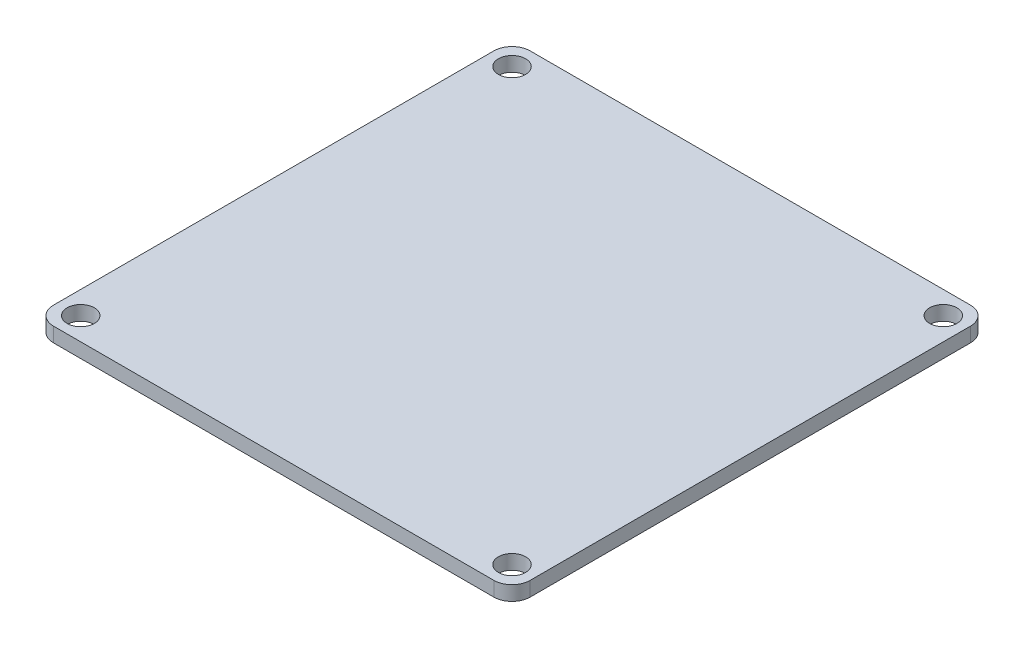
ISO-10303-21;
HEADER;
FILE_DESCRIPTION(('STEP AP214'),'2;1');
FILE_NAME('part.step','',(''),(''),'','','');
FILE_SCHEMA(('AUTOMOTIVE_DESIGN { 1 0 10303 214 1 1 1 1 }'));
ENDSEC;
DATA;
#1=APPLICATION_CONTEXT('core data for automotive mechanical design processes');
#2=APPLICATION_PROTOCOL_DEFINITION('international standard','automotive_design',2000,#1);
#3=PRODUCT_CONTEXT('',#1,'mechanical');
#4=PRODUCT('Part','Part','',(#3));
#5=PRODUCT_RELATED_PRODUCT_CATEGORY('part','',(#4));
#6=PRODUCT_DEFINITION_FORMATION('','',#4);
#7=PRODUCT_DEFINITION_CONTEXT('part definition',#1,'design');
#8=PRODUCT_DEFINITION('design','',#6,#7);
#9=PRODUCT_DEFINITION_SHAPE('','',#8);
#10=(LENGTH_UNIT() NAMED_UNIT(*) SI_UNIT(.MILLI.,.METRE.));
#11=(NAMED_UNIT(*) PLANE_ANGLE_UNIT() SI_UNIT($,.RADIAN.));
#12=(NAMED_UNIT(*) SI_UNIT($,.STERADIAN.) SOLID_ANGLE_UNIT());
#13=UNCERTAINTY_MEASURE_WITH_UNIT(LENGTH_MEASURE(1.E-05),#10,'distance_accuracy_value','');
#14=(GEOMETRIC_REPRESENTATION_CONTEXT(3) GLOBAL_UNCERTAINTY_ASSIGNED_CONTEXT((#13)) GLOBAL_UNIT_ASSIGNED_CONTEXT((#10,
#11,#12)) REPRESENTATION_CONTEXT('',''));
#15=CARTESIAN_POINT('',(0.,0.,0.));
#16=DIRECTION('',(0.,0.,1.));
#17=DIRECTION('',(1.,0.,0.));
#18=AXIS2_PLACEMENT_3D('',#15,#16,#17);
#19=CARTESIAN_POINT('',(0.,1.6,0.));
#20=DIRECTION('',(0.,-1.,0.));
#21=DIRECTION('',(0.,0.,-1.));
#22=AXIS2_PLACEMENT_3D('',#19,#20,#21);
#23=PLANE('',#22);
#24=DIRECTION('',(-1.,0.,0.));
#25=VECTOR('',#24,1.);
#26=CARTESIAN_POINT('',(-26.25,1.6,-26.25));
#27=LINE('',#26,#25);
#28=CARTESIAN_POINT('',(24.25,1.6,-26.25));
#29=VERTEX_POINT('',#28);
#30=CARTESIAN_POINT('',(-24.25,1.6,-26.25));
#31=VERTEX_POINT('',#30);
#32=EDGE_CURVE('E138',#29,#31,#27,.T.);
#33=ORIENTED_EDGE('',*,*,#32,.T.);
#34=CARTESIAN_POINT('',(-24.25,1.6,-24.25));
#35=DIRECTION('',(0.,-1.,0.));
#36=DIRECTION('',(0.,0.,-1.));
#37=AXIS2_PLACEMENT_3D('',#34,#35,#36);
#38=CIRCLE('',#37,2.);
#39=CARTESIAN_POINT('',(-26.25,1.6,-24.25));
#40=VERTEX_POINT('',#39);
#41=EDGE_CURVE('E153',#31,#40,#38,.F.);
#42=ORIENTED_EDGE('',*,*,#41,.T.);
#43=DIRECTION('',(0.,0.,1.));
#44=VECTOR('',#43,1.);
#45=CARTESIAN_POINT('',(-26.25,1.6,-26.25));
#46=LINE('',#45,#44);
#47=CARTESIAN_POINT('',(-26.25,1.6,24.25));
#48=VERTEX_POINT('',#47);
#49=EDGE_CURVE('E120',#40,#48,#46,.T.);
#50=ORIENTED_EDGE('',*,*,#49,.T.);
#51=CARTESIAN_POINT('',(-24.25,1.6,24.25));
#52=DIRECTION('',(0.,-1.,0.));
#53=DIRECTION('',(0.,0.,-1.));
#54=AXIS2_PLACEMENT_3D('',#51,#52,#53);
#55=CIRCLE('',#54,2.);
#56=CARTESIAN_POINT('',(-24.25,1.6,26.25));
#57=VERTEX_POINT('',#56);
#58=EDGE_CURVE('E151',#48,#57,#55,.F.);
#59=ORIENTED_EDGE('',*,*,#58,.T.);
#60=DIRECTION('',(1.,0.,0.));
#61=VECTOR('',#60,1.);
#62=CARTESIAN_POINT('',(-26.25,1.6,26.25));
#63=LINE('',#62,#61);
#64=CARTESIAN_POINT('',(24.25,1.6,26.25));
#65=VERTEX_POINT('',#64);
#66=EDGE_CURVE('E173',#57,#65,#63,.T.);
#67=ORIENTED_EDGE('',*,*,#66,.T.);
#68=CARTESIAN_POINT('',(24.25,1.6,24.25));
#69=DIRECTION('',(0.,-1.,0.));
#70=DIRECTION('',(0.,0.,-1.));
#71=AXIS2_PLACEMENT_3D('',#68,#69,#70);
#72=CIRCLE('',#71,2.);
#73=CARTESIAN_POINT('',(26.25,1.6,24.25));
#74=VERTEX_POINT('',#73);
#75=EDGE_CURVE('E55',#65,#74,#72,.F.);
#76=ORIENTED_EDGE('',*,*,#75,.T.);
#77=DIRECTION('',(0.,0.,-1.));
#78=VECTOR('',#77,1.);
#79=CARTESIAN_POINT('',(26.25,1.6,-26.25));
#80=LINE('',#79,#78);
#81=CARTESIAN_POINT('',(26.25,1.6,-24.25));
#82=VERTEX_POINT('',#81);
#83=EDGE_CURVE('E139',#74,#82,#80,.T.);
#84=ORIENTED_EDGE('',*,*,#83,.T.);
#85=CARTESIAN_POINT('',(24.25,1.6,-24.25));
#86=DIRECTION('',(0.,-1.,0.));
#87=DIRECTION('',(0.,0.,-1.));
#88=AXIS2_PLACEMENT_3D('',#85,#86,#87);
#89=CIRCLE('',#88,2.);
#90=EDGE_CURVE('E149',#82,#29,#89,.F.);
#91=ORIENTED_EDGE('',*,*,#90,.T.);
#92=EDGE_LOOP('',(#33,#42,#50,#59,#67,#76,#84,#91));
#93=FACE_BOUND('',#92,.T.);
#94=CARTESIAN_POINT('',(-23.75,1.6,-23.75));
#95=DIRECTION('',(0.,1.,0.));
#96=DIRECTION('',(0.,0.,1.));
#97=AXIS2_PLACEMENT_3D('',#94,#95,#96);
#98=CIRCLE('',#97,1.5);
#99=CARTESIAN_POINT('',(-23.75,1.6,-22.25));
#100=VERTEX_POINT('',#99);
#101=EDGE_CURVE('E133',#100,#100,#98,.T.);
#102=ORIENTED_EDGE('',*,*,#101,.F.);
#103=EDGE_LOOP('',(#102));
#104=FACE_BOUND('',#103,.T.);
#105=CARTESIAN_POINT('',(23.75,1.6,-23.75));
#106=DIRECTION('',(0.,1.,0.));
#107=DIRECTION('',(0.,0.,-1.));
#108=AXIS2_PLACEMENT_3D('',#105,#106,#107);
#109=CIRCLE('',#108,1.5);
#110=CARTESIAN_POINT('',(23.75,1.6,-25.25));
#111=VERTEX_POINT('',#110);
#112=EDGE_CURVE('E188',#111,#111,#109,.T.);
#113=ORIENTED_EDGE('',*,*,#112,.F.);
#114=EDGE_LOOP('',(#113));
#115=FACE_BOUND('',#114,.T.);
#116=CARTESIAN_POINT('',(23.75,1.6,23.75));
#117=DIRECTION('',(0.,1.,0.));
#118=DIRECTION('',(0.,0.,1.));
#119=AXIS2_PLACEMENT_3D('',#116,#117,#118);
#120=CIRCLE('',#119,1.5);
#121=CARTESIAN_POINT('',(23.75,1.6,25.25));
#122=VERTEX_POINT('',#121);
#123=EDGE_CURVE('E192',#122,#122,#120,.T.);
#124=ORIENTED_EDGE('',*,*,#123,.F.);
#125=EDGE_LOOP('',(#124));
#126=FACE_BOUND('',#125,.T.);
#127=CARTESIAN_POINT('',(-23.75,1.6,23.75));
#128=DIRECTION('',(0.,1.,0.));
#129=DIRECTION('',(0.,0.,-1.));
#130=AXIS2_PLACEMENT_3D('',#127,#128,#129);
#131=CIRCLE('',#130,1.5);
#132=CARTESIAN_POINT('',(-23.75,1.6,22.25));
#133=VERTEX_POINT('',#132);
#134=EDGE_CURVE('E195',#133,#133,#131,.T.);
#135=ORIENTED_EDGE('',*,*,#134,.F.);
#136=EDGE_LOOP('',(#135));
#137=FACE_BOUND('',#136,.T.);
#138=ADVANCED_FACE('F35',(#93,#104,#115,#126,#137),#23,.F.);
#139=CARTESIAN_POINT('',(0.,0.,0.));
#140=DIRECTION('',(0.,-1.,0.));
#141=DIRECTION('',(0.,0.,-1.));
#142=AXIS2_PLACEMENT_3D('',#139,#140,#141);
#143=PLANE('',#142);
#144=CARTESIAN_POINT('',(23.75,0.,23.75));
#145=DIRECTION('',(0.,1.,0.));
#146=DIRECTION('',(0.,0.,1.));
#147=AXIS2_PLACEMENT_3D('',#144,#145,#146);
#148=CIRCLE('',#147,1.5);
#149=CARTESIAN_POINT('',(23.75,0.,25.25));
#150=VERTEX_POINT('',#149);
#151=EDGE_CURVE('E197',#150,#150,#148,.T.);
#152=ORIENTED_EDGE('',*,*,#151,.T.);
#153=EDGE_LOOP('',(#152));
#154=FACE_BOUND('',#153,.T.);
#155=CARTESIAN_POINT('',(-23.75,0.,-23.75));
#156=DIRECTION('',(0.,1.,0.));
#157=DIRECTION('',(0.,0.,1.));
#158=AXIS2_PLACEMENT_3D('',#155,#156,#157);
#159=CIRCLE('',#158,1.5);
#160=CARTESIAN_POINT('',(-23.75,0.,-22.25));
#161=VERTEX_POINT('',#160);
#162=EDGE_CURVE('E176',#161,#161,#159,.T.);
#163=ORIENTED_EDGE('',*,*,#162,.T.);
#164=EDGE_LOOP('',(#163));
#165=FACE_BOUND('',#164,.T.);
#166=DIRECTION('',(0.,0.,1.));
#167=VECTOR('',#166,1.);
#168=CARTESIAN_POINT('',(-26.25,0.,-26.25));
#169=LINE('',#168,#167);
#170=CARTESIAN_POINT('',(-26.25,0.,-24.25));
#171=VERTEX_POINT('',#170);
#172=CARTESIAN_POINT('',(-26.25,0.,24.25));
#173=VERTEX_POINT('',#172);
#174=EDGE_CURVE('E117',#171,#173,#169,.T.);
#175=ORIENTED_EDGE('',*,*,#174,.F.);
#176=CARTESIAN_POINT('',(-24.25,0.,-24.25));
#177=DIRECTION('',(0.,-1.,0.));
#178=DIRECTION('',(0.,0.,-1.));
#179=AXIS2_PLACEMENT_3D('',#176,#177,#178);
#180=CIRCLE('',#179,2.);
#181=CARTESIAN_POINT('',(-24.25,0.,-26.25));
#182=VERTEX_POINT('',#181);
#183=EDGE_CURVE('E100',#171,#182,#180,.T.);
#184=ORIENTED_EDGE('',*,*,#183,.T.);
#185=DIRECTION('',(-1.,0.,0.));
#186=VECTOR('',#185,1.);
#187=CARTESIAN_POINT('',(-26.25,0.,-26.25));
#188=LINE('',#187,#186);
#189=CARTESIAN_POINT('',(24.25,0.,-26.25));
#190=VERTEX_POINT('',#189);
#191=EDGE_CURVE('E128',#190,#182,#188,.T.);
#192=ORIENTED_EDGE('',*,*,#191,.F.);
#193=CARTESIAN_POINT('',(24.25,0.,-24.25));
#194=DIRECTION('',(0.,-1.,0.));
#195=DIRECTION('',(0.,0.,-1.));
#196=AXIS2_PLACEMENT_3D('',#193,#194,#195);
#197=CIRCLE('',#196,2.);
#198=CARTESIAN_POINT('',(26.25,0.,-24.25));
#199=VERTEX_POINT('',#198);
#200=EDGE_CURVE('E142',#190,#199,#197,.T.);
#201=ORIENTED_EDGE('',*,*,#200,.T.);
#202=DIRECTION('',(0.,0.,-1.));
#203=VECTOR('',#202,1.);
#204=CARTESIAN_POINT('',(26.25,0.,-26.25));
#205=LINE('',#204,#203);
#206=CARTESIAN_POINT('',(26.25,0.,24.25));
#207=VERTEX_POINT('',#206);
#208=EDGE_CURVE('E131',#207,#199,#205,.T.);
#209=ORIENTED_EDGE('',*,*,#208,.F.);
#210=CARTESIAN_POINT('',(24.25,0.,24.25));
#211=DIRECTION('',(0.,-1.,0.));
#212=DIRECTION('',(0.,0.,-1.));
#213=AXIS2_PLACEMENT_3D('',#210,#211,#212);
#214=CIRCLE('',#213,2.);
#215=CARTESIAN_POINT('',(24.25,0.,26.25));
#216=VERTEX_POINT('',#215);
#217=EDGE_CURVE('E121',#207,#216,#214,.T.);
#218=ORIENTED_EDGE('',*,*,#217,.T.);
#219=DIRECTION('',(1.,0.,0.));
#220=VECTOR('',#219,1.);
#221=CARTESIAN_POINT('',(-26.25,0.,26.25));
#222=LINE('',#221,#220);
#223=CARTESIAN_POINT('',(-24.25,0.,26.25));
#224=VERTEX_POINT('',#223);
#225=EDGE_CURVE('E127',#224,#216,#222,.T.);
#226=ORIENTED_EDGE('',*,*,#225,.F.);
#227=CARTESIAN_POINT('',(-24.25,0.,24.25));
#228=DIRECTION('',(0.,-1.,0.));
#229=DIRECTION('',(0.,0.,-1.));
#230=AXIS2_PLACEMENT_3D('',#227,#228,#229);
#231=CIRCLE('',#230,2.);
#232=EDGE_CURVE('E111',#224,#173,#231,.T.);
#233=ORIENTED_EDGE('',*,*,#232,.T.);
#234=EDGE_LOOP('',(#175,#184,#192,#201,#209,#218,#226,#233));
#235=FACE_BOUND('',#234,.T.);
#236=CARTESIAN_POINT('',(23.75,0.,-23.75));
#237=DIRECTION('',(0.,1.,0.));
#238=DIRECTION('',(0.,0.,-1.));
#239=AXIS2_PLACEMENT_3D('',#236,#237,#238);
#240=CIRCLE('',#239,1.5);
#241=CARTESIAN_POINT('',(23.75,0.,-25.25));
#242=VERTEX_POINT('',#241);
#243=EDGE_CURVE('E205',#242,#242,#240,.T.);
#244=ORIENTED_EDGE('',*,*,#243,.T.);
#245=EDGE_LOOP('',(#244));
#246=FACE_BOUND('',#245,.T.);
#247=CARTESIAN_POINT('',(-23.75,0.,23.75));
#248=DIRECTION('',(0.,1.,0.));
#249=DIRECTION('',(0.,0.,-1.));
#250=AXIS2_PLACEMENT_3D('',#247,#248,#249);
#251=CIRCLE('',#250,1.5);
#252=CARTESIAN_POINT('',(-23.75,0.,22.25));
#253=VERTEX_POINT('',#252);
#254=EDGE_CURVE('E198',#253,#253,#251,.T.);
#255=ORIENTED_EDGE('',*,*,#254,.T.);
#256=EDGE_LOOP('',(#255));
#257=FACE_BOUND('',#256,.T.);
#258=ADVANCED_FACE('F124',(#154,#165,#235,#246,#257),#143,.T.);
#259=CARTESIAN_POINT('',(-26.25,1.6,-26.25));
#260=DIRECTION('',(0.,0.,1.));
#261=DIRECTION('',(1.,0.,0.));
#262=AXIS2_PLACEMENT_3D('',#259,#260,#261);
#263=PLANE('',#262);
#264=ORIENTED_EDGE('',*,*,#191,.T.);
#265=DIRECTION('',(0.,-1.,0.));
#266=VECTOR('',#265,1.);
#267=CARTESIAN_POINT('',(-24.25,1.6,-26.25));
#268=LINE('',#267,#266);
#269=EDGE_CURVE('E105',#182,#31,#268,.F.);
#270=ORIENTED_EDGE('',*,*,#269,.T.);
#271=ORIENTED_EDGE('',*,*,#32,.F.);
#272=DIRECTION('',(0.,-1.,0.));
#273=VECTOR('',#272,1.);
#274=CARTESIAN_POINT('',(24.25,1.6,-26.25));
#275=LINE('',#274,#273);
#276=EDGE_CURVE('E110',#29,#190,#275,.T.);
#277=ORIENTED_EDGE('',*,*,#276,.T.);
#278=EDGE_LOOP('',(#264,#270,#271,#277));
#279=FACE_BOUND('',#278,.T.);
#280=ADVANCED_FACE('F170',(#279),#263,.F.);
#281=CARTESIAN_POINT('',(-26.25,1.6,-26.25));
#282=DIRECTION('',(1.,0.,0.));
#283=DIRECTION('',(0.,0.,-1.));
#284=AXIS2_PLACEMENT_3D('',#281,#282,#283);
#285=PLANE('',#284);
#286=ORIENTED_EDGE('',*,*,#49,.F.);
#287=DIRECTION('',(0.,-1.,0.));
#288=VECTOR('',#287,1.);
#289=CARTESIAN_POINT('',(-26.25,1.6,-24.25));
#290=LINE('',#289,#288);
#291=EDGE_CURVE('E104',#40,#171,#290,.T.);
#292=ORIENTED_EDGE('',*,*,#291,.T.);
#293=ORIENTED_EDGE('',*,*,#174,.T.);
#294=DIRECTION('',(0.,-1.,0.));
#295=VECTOR('',#294,1.);
#296=CARTESIAN_POINT('',(-26.25,1.6,24.25));
#297=LINE('',#296,#295);
#298=EDGE_CURVE('E122',#173,#48,#297,.F.);
#299=ORIENTED_EDGE('',*,*,#298,.T.);
#300=EDGE_LOOP('',(#286,#292,#293,#299));
#301=FACE_BOUND('',#300,.T.);
#302=ADVANCED_FACE('F116',(#301),#285,.F.);
#303=CARTESIAN_POINT('',(-26.25,1.6,26.25));
#304=DIRECTION('',(0.,0.,-1.));
#305=DIRECTION('',(-1.,0.,0.));
#306=AXIS2_PLACEMENT_3D('',#303,#304,#305);
#307=PLANE('',#306);
#308=ORIENTED_EDGE('',*,*,#66,.F.);
#309=DIRECTION('',(0.,-1.,0.));
#310=VECTOR('',#309,1.);
#311=CARTESIAN_POINT('',(-24.25,1.6,26.25));
#312=LINE('',#311,#310);
#313=EDGE_CURVE('E157',#57,#224,#312,.T.);
#314=ORIENTED_EDGE('',*,*,#313,.T.);
#315=ORIENTED_EDGE('',*,*,#225,.T.);
#316=DIRECTION('',(0.,-1.,0.));
#317=VECTOR('',#316,1.);
#318=CARTESIAN_POINT('',(24.25,1.6,26.25));
#319=LINE('',#318,#317);
#320=EDGE_CURVE('E155',#216,#65,#319,.F.);
#321=ORIENTED_EDGE('',*,*,#320,.T.);
#322=EDGE_LOOP('',(#308,#314,#315,#321));
#323=FACE_BOUND('',#322,.T.);
#324=ADVANCED_FACE('F225',(#323),#307,.F.);
#325=CARTESIAN_POINT('',(26.25,1.6,-26.25));
#326=DIRECTION('',(-1.,0.,0.));
#327=DIRECTION('',(0.,0.,1.));
#328=AXIS2_PLACEMENT_3D('',#325,#326,#327);
#329=PLANE('',#328);
#330=ORIENTED_EDGE('',*,*,#208,.T.);
#331=DIRECTION('',(0.,-1.,0.));
#332=VECTOR('',#331,1.);
#333=CARTESIAN_POINT('',(26.25,1.6,-24.25));
#334=LINE('',#333,#332);
#335=EDGE_CURVE('E11',#199,#82,#334,.F.);
#336=ORIENTED_EDGE('',*,*,#335,.T.);
#337=ORIENTED_EDGE('',*,*,#83,.F.);
#338=DIRECTION('',(0.,-1.,0.));
#339=VECTOR('',#338,1.);
#340=CARTESIAN_POINT('',(26.25,1.6,24.25));
#341=LINE('',#340,#339);
#342=EDGE_CURVE('E43',#74,#207,#341,.T.);
#343=ORIENTED_EDGE('',*,*,#342,.T.);
#344=EDGE_LOOP('',(#330,#336,#337,#343));
#345=FACE_BOUND('',#344,.T.);
#346=ADVANCED_FACE('F162',(#345),#329,.F.);
#347=CARTESIAN_POINT('',(-23.75,1.6,-23.75));
#348=DIRECTION('',(0.,-1.,0.));
#349=DIRECTION('',(0.,0.,-1.));
#350=AXIS2_PLACEMENT_3D('',#347,#348,#349);
#351=CYLINDRICAL_SURFACE('',#350,1.5);
#352=ORIENTED_EDGE('',*,*,#101,.T.);
#353=EDGE_LOOP('',(#352));
#354=FACE_BOUND('',#353,.T.);
#355=ORIENTED_EDGE('',*,*,#162,.F.);
#356=EDGE_LOOP('',(#355));
#357=FACE_BOUND('',#356,.T.);
#358=ADVANCED_FACE('F214',(#354,#357),#351,.F.);
#359=CARTESIAN_POINT('',(23.75,1.6,-23.75));
#360=DIRECTION('',(0.,-1.,0.));
#361=DIRECTION('',(0.,0.,-1.));
#362=AXIS2_PLACEMENT_3D('',#359,#360,#361);
#363=CYLINDRICAL_SURFACE('',#362,1.5);
#364=ORIENTED_EDGE('',*,*,#112,.T.);
#365=EDGE_LOOP('',(#364));
#366=FACE_BOUND('',#365,.T.);
#367=ORIENTED_EDGE('',*,*,#243,.F.);
#368=EDGE_LOOP('',(#367));
#369=FACE_BOUND('',#368,.T.);
#370=ADVANCED_FACE('F216',(#366,#369),#363,.F.);
#371=CARTESIAN_POINT('',(23.75,1.6,23.75));
#372=DIRECTION('',(0.,-1.,0.));
#373=DIRECTION('',(0.,0.,-1.));
#374=AXIS2_PLACEMENT_3D('',#371,#372,#373);
#375=CYLINDRICAL_SURFACE('',#374,1.5);
#376=ORIENTED_EDGE('',*,*,#123,.T.);
#377=EDGE_LOOP('',(#376));
#378=FACE_BOUND('',#377,.T.);
#379=ORIENTED_EDGE('',*,*,#151,.F.);
#380=EDGE_LOOP('',(#379));
#381=FACE_BOUND('',#380,.T.);
#382=ADVANCED_FACE('F222',(#378,#381),#375,.F.);
#383=CARTESIAN_POINT('',(-23.75,1.6,23.75));
#384=DIRECTION('',(0.,-1.,0.));
#385=DIRECTION('',(0.,0.,-1.));
#386=AXIS2_PLACEMENT_3D('',#383,#384,#385);
#387=CYLINDRICAL_SURFACE('',#386,1.5);
#388=ORIENTED_EDGE('',*,*,#134,.T.);
#389=EDGE_LOOP('',(#388));
#390=FACE_BOUND('',#389,.T.);
#391=ORIENTED_EDGE('',*,*,#254,.F.);
#392=EDGE_LOOP('',(#391));
#393=FACE_BOUND('',#392,.T.);
#394=ADVANCED_FACE('F242',(#390,#393),#387,.F.);
#395=CARTESIAN_POINT('',(-24.25,1.6,-24.25));
#396=DIRECTION('',(0.,-1.,0.));
#397=DIRECTION('',(0.,0.,-1.));
#398=AXIS2_PLACEMENT_3D('',#395,#396,#397);
#399=CYLINDRICAL_SURFACE('',#398,2.);
#400=ORIENTED_EDGE('',*,*,#41,.F.);
#401=ORIENTED_EDGE('',*,*,#269,.F.);
#402=ORIENTED_EDGE('',*,*,#183,.F.);
#403=ORIENTED_EDGE('',*,*,#291,.F.);
#404=EDGE_LOOP('',(#400,#401,#402,#403));
#405=FACE_BOUND('',#404,.T.);
#406=ADVANCED_FACE('F103',(#405),#399,.T.);
#407=CARTESIAN_POINT('',(-24.25,1.6,24.25));
#408=DIRECTION('',(0.,-1.,0.));
#409=DIRECTION('',(0.,0.,-1.));
#410=AXIS2_PLACEMENT_3D('',#407,#408,#409);
#411=CYLINDRICAL_SURFACE('',#410,2.);
#412=ORIENTED_EDGE('',*,*,#58,.F.);
#413=ORIENTED_EDGE('',*,*,#298,.F.);
#414=ORIENTED_EDGE('',*,*,#232,.F.);
#415=ORIENTED_EDGE('',*,*,#313,.F.);
#416=EDGE_LOOP('',(#412,#413,#414,#415));
#417=FACE_BOUND('',#416,.T.);
#418=ADVANCED_FACE('F241',(#417),#411,.T.);
#419=CARTESIAN_POINT('',(24.25,1.6,-24.25));
#420=DIRECTION('',(0.,-1.,0.));
#421=DIRECTION('',(0.,0.,-1.));
#422=AXIS2_PLACEMENT_3D('',#419,#420,#421);
#423=CYLINDRICAL_SURFACE('',#422,2.);
#424=ORIENTED_EDGE('',*,*,#90,.F.);
#425=ORIENTED_EDGE('',*,*,#335,.F.);
#426=ORIENTED_EDGE('',*,*,#200,.F.);
#427=ORIENTED_EDGE('',*,*,#276,.F.);
#428=EDGE_LOOP('',(#424,#425,#426,#427));
#429=FACE_BOUND('',#428,.T.);
#430=ADVANCED_FACE('F167',(#429),#423,.T.);
#431=CARTESIAN_POINT('',(24.25,1.6,24.25));
#432=DIRECTION('',(0.,-1.,0.));
#433=DIRECTION('',(0.,0.,-1.));
#434=AXIS2_PLACEMENT_3D('',#431,#432,#433);
#435=CYLINDRICAL_SURFACE('',#434,2.);
#436=ORIENTED_EDGE('',*,*,#75,.F.);
#437=ORIENTED_EDGE('',*,*,#320,.F.);
#438=ORIENTED_EDGE('',*,*,#217,.F.);
#439=ORIENTED_EDGE('',*,*,#342,.F.);
#440=EDGE_LOOP('',(#436,#437,#438,#439));
#441=FACE_BOUND('',#440,.T.);
#442=ADVANCED_FACE('F37',(#441),#435,.T.);
#443=CLOSED_SHELL('',(#138,#258,#280,#302,#324,#346,#358,#370,#382,#394,#406,#418,#430,#442));
#444=MANIFOLD_SOLID_BREP('B2',#443);
#445=ADVANCED_BREP_SHAPE_REPRESENTATION('',(#18,#444),#14);
#446=SHAPE_DEFINITION_REPRESENTATION(#9,#445);
ENDSEC;
END-ISO-10303-21;
